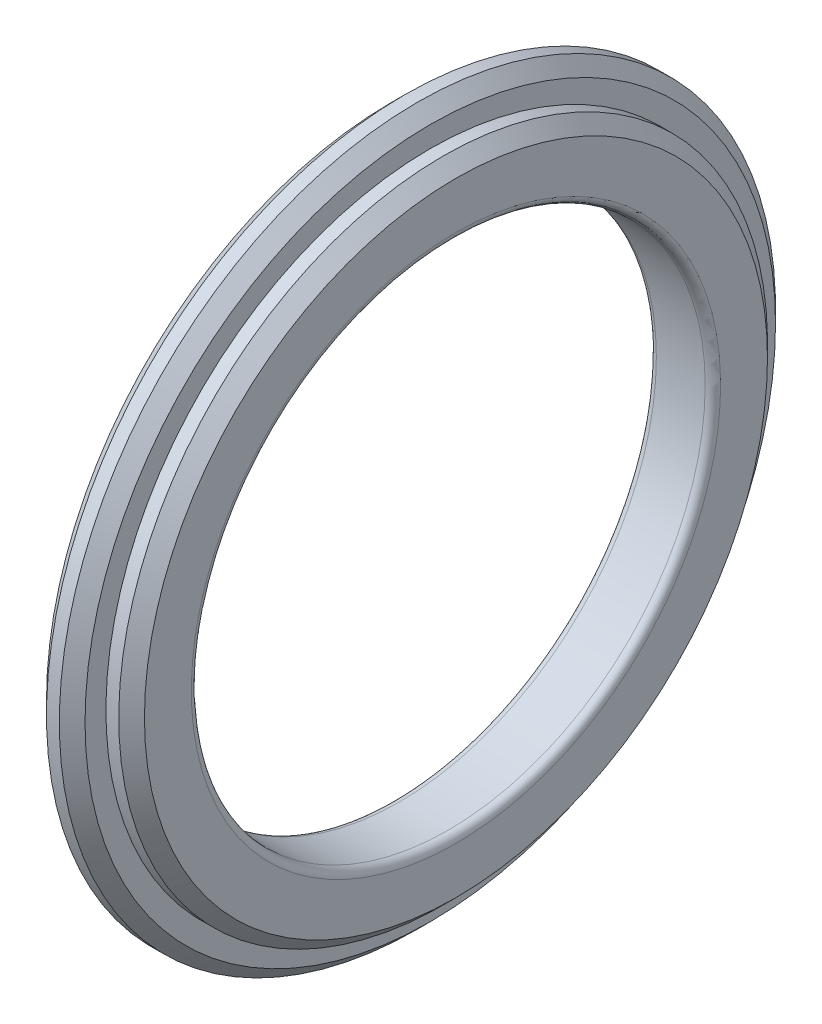
ISO-10303-21;
HEADER;
FILE_DESCRIPTION(('STEP AP214'),'2;1');
FILE_NAME('part.step','',(''),(''),'','','');
FILE_SCHEMA(('AUTOMOTIVE_DESIGN { 1 0 10303 214 1 1 1 1 }'));
ENDSEC;
DATA;
#1=APPLICATION_CONTEXT('core data for automotive mechanical design processes');
#2=APPLICATION_PROTOCOL_DEFINITION('international standard','automotive_design',2000,#1);
#3=PRODUCT_CONTEXT('',#1,'mechanical');
#4=PRODUCT('Part','Part','',(#3));
#5=PRODUCT_RELATED_PRODUCT_CATEGORY('part','',(#4));
#6=PRODUCT_DEFINITION_FORMATION('','',#4);
#7=PRODUCT_DEFINITION_CONTEXT('part definition',#1,'design');
#8=PRODUCT_DEFINITION('design','',#6,#7);
#9=PRODUCT_DEFINITION_SHAPE('','',#8);
#10=(LENGTH_UNIT() NAMED_UNIT(*) SI_UNIT(.MILLI.,.METRE.));
#11=(NAMED_UNIT(*) PLANE_ANGLE_UNIT() SI_UNIT($,.RADIAN.));
#12=(NAMED_UNIT(*) SI_UNIT($,.STERADIAN.) SOLID_ANGLE_UNIT());
#13=UNCERTAINTY_MEASURE_WITH_UNIT(LENGTH_MEASURE(1.E-05),#10,'distance_accuracy_value','');
#14=(GEOMETRIC_REPRESENTATION_CONTEXT(3) GLOBAL_UNCERTAINTY_ASSIGNED_CONTEXT((#13)) GLOBAL_UNIT_ASSIGNED_CONTEXT((#10,
#11,#12)) REPRESENTATION_CONTEXT('',''));
#15=CARTESIAN_POINT('',(0.,0.,0.));
#16=DIRECTION('',(0.,0.,1.));
#17=DIRECTION('',(1.,0.,0.));
#18=AXIS2_PLACEMENT_3D('',#15,#16,#17);
#19=CARTESIAN_POINT('',(30.5,0.,0.));
#20=DIRECTION('',(-1.,0.,0.));
#21=DIRECTION('',(0.,1.,0.));
#22=AXIS2_PLACEMENT_3D('',#19,#20,#21);
#23=CONICAL_SURFACE('',#22,24.75,0.785398163397448);
#24=CARTESIAN_POINT('',(30.,0.,0.));
#25=DIRECTION('',(1.,0.,0.));
#26=DIRECTION('',(0.,1.,0.));
#27=AXIS2_PLACEMENT_3D('',#24,#25,#26);
#28=CIRCLE('',#27,25.25);
#29=CARTESIAN_POINT('',(30.,25.25,0.));
#30=VERTEX_POINT('',#29);
#31=EDGE_CURVE('E11',#30,#30,#28,.T.);
#32=ORIENTED_EDGE('',*,*,#31,.T.);
#33=EDGE_LOOP('',(#32));
#34=FACE_BOUND('',#33,.T.);
#35=CARTESIAN_POINT('',(31.,0.,0.));
#36=DIRECTION('',(1.,0.,0.));
#37=DIRECTION('',(0.,1.,0.));
#38=AXIS2_PLACEMENT_3D('',#35,#36,#37);
#39=CIRCLE('',#38,24.25);
#40=CARTESIAN_POINT('',(31.,24.25,0.));
#41=VERTEX_POINT('',#40);
#42=EDGE_CURVE('E83',#41,#41,#39,.T.);
#43=ORIENTED_EDGE('',*,*,#42,.F.);
#44=EDGE_LOOP('',(#43));
#45=FACE_BOUND('',#44,.T.);
#46=ADVANCED_FACE('F17',(#34,#45),#23,.T.);
#47=CARTESIAN_POINT('',(29.5,0.,0.));
#48=DIRECTION('',(-1.,0.,0.));
#49=DIRECTION('',(0.,1.,0.));
#50=AXIS2_PLACEMENT_3D('',#47,#48,#49);
#51=CYLINDRICAL_SURFACE('',#50,25.25);
#52=CARTESIAN_POINT('',(29.,0.,0.));
#53=DIRECTION('',(1.,0.,0.));
#54=DIRECTION('',(0.,1.,0.));
#55=AXIS2_PLACEMENT_3D('',#52,#53,#54);
#56=CIRCLE('',#55,25.25);
#57=CARTESIAN_POINT('',(29.,25.25,0.));
#58=VERTEX_POINT('',#57);
#59=EDGE_CURVE('E27',#58,#58,#56,.T.);
#60=ORIENTED_EDGE('',*,*,#59,.T.);
#61=EDGE_LOOP('',(#60));
#62=FACE_BOUND('',#61,.T.);
#63=ORIENTED_EDGE('',*,*,#31,.F.);
#64=EDGE_LOOP('',(#63));
#65=FACE_BOUND('',#64,.T.);
#66=ADVANCED_FACE('F112',(#62,#65),#51,.T.);
#67=CARTESIAN_POINT('',(29.,26.0625,0.));
#68=DIRECTION('',(1.,0.,0.));
#69=DIRECTION('',(0.,1.,0.));
#70=AXIS2_PLACEMENT_3D('',#67,#68,#69);
#71=PLANE('',#70);
#72=CARTESIAN_POINT('',(29.,0.,0.));
#73=DIRECTION('',(1.,0.,0.));
#74=DIRECTION('',(0.,1.,0.));
#75=AXIS2_PLACEMENT_3D('',#72,#73,#74);
#76=CIRCLE('',#75,26.875);
#77=CARTESIAN_POINT('',(29.,26.875,0.));
#78=VERTEX_POINT('',#77);
#79=EDGE_CURVE('E70',#78,#78,#76,.T.);
#80=ORIENTED_EDGE('',*,*,#79,.T.);
#81=EDGE_LOOP('',(#80));
#82=FACE_BOUND('',#81,.T.);
#83=ORIENTED_EDGE('',*,*,#59,.F.);
#84=EDGE_LOOP('',(#83));
#85=FACE_BOUND('',#84,.T.);
#86=ADVANCED_FACE('F71',(#82,#85),#71,.T.);
#87=CARTESIAN_POINT('',(28.5,0.,0.));
#88=DIRECTION('',(-1.,0.,0.));
#89=DIRECTION('',(0.,1.,0.));
#90=AXIS2_PLACEMENT_3D('',#87,#88,#89);
#91=CONICAL_SURFACE('',#90,27.375,0.785398163397448);
#92=CARTESIAN_POINT('',(28.,0.,0.));
#93=DIRECTION('',(1.,0.,0.));
#94=DIRECTION('',(0.,1.,0.));
#95=AXIS2_PLACEMENT_3D('',#92,#93,#94);
#96=CIRCLE('',#95,27.875);
#97=CARTESIAN_POINT('',(28.,27.875,0.));
#98=VERTEX_POINT('',#97);
#99=EDGE_CURVE('E66',#98,#98,#96,.T.);
#100=ORIENTED_EDGE('',*,*,#99,.T.);
#101=EDGE_LOOP('',(#100));
#102=FACE_BOUND('',#101,.T.);
#103=ORIENTED_EDGE('',*,*,#79,.F.);
#104=EDGE_LOOP('',(#103));
#105=FACE_BOUND('',#104,.T.);
#106=ADVANCED_FACE('F120',(#102,#105),#91,.T.);
#107=CARTESIAN_POINT('',(27.5,0.,0.));
#108=DIRECTION('',(-1.,0.,0.));
#109=DIRECTION('',(0.,1.,0.));
#110=AXIS2_PLACEMENT_3D('',#107,#108,#109);
#111=CYLINDRICAL_SURFACE('',#110,27.875);
#112=CARTESIAN_POINT('',(27.,0.,0.));
#113=DIRECTION('',(1.,0.,0.));
#114=DIRECTION('',(0.,1.,0.));
#115=AXIS2_PLACEMENT_3D('',#112,#113,#114);
#116=CIRCLE('',#115,27.875);
#117=CARTESIAN_POINT('',(27.,27.875,0.));
#118=VERTEX_POINT('',#117);
#119=EDGE_CURVE('E62',#118,#118,#116,.T.);
#120=ORIENTED_EDGE('',*,*,#119,.T.);
#121=EDGE_LOOP('',(#120));
#122=FACE_BOUND('',#121,.T.);
#123=ORIENTED_EDGE('',*,*,#99,.F.);
#124=EDGE_LOOP('',(#123));
#125=FACE_BOUND('',#124,.T.);
#126=ADVANCED_FACE('F19',(#122,#125),#111,.T.);
#127=CARTESIAN_POINT('',(26.5,0.,0.));
#128=DIRECTION('',(1.,0.,0.));
#129=DIRECTION('',(0.,1.,0.));
#130=AXIS2_PLACEMENT_3D('',#127,#128,#129);
#131=CONICAL_SURFACE('',#130,27.375,0.785398163397448);
#132=CARTESIAN_POINT('',(26.,0.,0.));
#133=DIRECTION('',(1.,0.,0.));
#134=DIRECTION('',(0.,1.,0.));
#135=AXIS2_PLACEMENT_3D('',#132,#133,#134);
#136=CIRCLE('',#135,26.875);
#137=CARTESIAN_POINT('',(26.,26.875,0.));
#138=VERTEX_POINT('',#137);
#139=EDGE_CURVE('E58',#138,#138,#136,.T.);
#140=ORIENTED_EDGE('',*,*,#139,.T.);
#141=EDGE_LOOP('',(#140));
#142=FACE_BOUND('',#141,.T.);
#143=ORIENTED_EDGE('',*,*,#119,.F.);
#144=EDGE_LOOP('',(#143));
#145=FACE_BOUND('',#144,.T.);
#146=ADVANCED_FACE('F108',(#142,#145),#131,.T.);
#147=CARTESIAN_POINT('',(26.,23.7375,0.));
#148=DIRECTION('',(-1.,0.,0.));
#149=DIRECTION('',(0.,-1.,0.));
#150=AXIS2_PLACEMENT_3D('',#147,#148,#149);
#151=PLANE('',#150);
#152=CARTESIAN_POINT('',(26.,0.,0.));
#153=DIRECTION('',(1.,0.,0.));
#154=DIRECTION('',(0.,1.,0.));
#155=AXIS2_PLACEMENT_3D('',#152,#153,#154);
#156=CIRCLE('',#155,20.6);
#157=CARTESIAN_POINT('',(26.,20.6,0.));
#158=VERTEX_POINT('',#157);
#159=EDGE_CURVE('E80',#158,#158,#156,.T.);
#160=ORIENTED_EDGE('',*,*,#159,.T.);
#161=EDGE_LOOP('',(#160));
#162=FACE_BOUND('',#161,.T.);
#163=ORIENTED_EDGE('',*,*,#139,.F.);
#164=EDGE_LOOP('',(#163));
#165=FACE_BOUND('',#164,.T.);
#166=ADVANCED_FACE('F94',(#162,#165),#151,.T.);
#167=CARTESIAN_POINT('',(26.6,0.,0.));
#168=DIRECTION('',(1.,0.,0.));
#169=DIRECTION('',(0.,0.,-1.));
#170=AXIS2_PLACEMENT_3D('',#167,#168,#169);
#171=TOROIDAL_SURFACE('',#170,20.6,0.6);
#172=CARTESIAN_POINT('',(26.6,0.,0.));
#173=DIRECTION('',(1.,0.,0.));
#174=DIRECTION('',(0.,1.,0.));
#175=AXIS2_PLACEMENT_3D('',#172,#173,#174);
#176=CIRCLE('',#175,20.);
#177=CARTESIAN_POINT('',(26.6,20.,0.));
#178=VERTEX_POINT('',#177);
#179=EDGE_CURVE('E79',#178,#178,#176,.T.);
#180=ORIENTED_EDGE('',*,*,#179,.T.);
#181=EDGE_LOOP('',(#180));
#182=FACE_BOUND('',#181,.T.);
#183=ORIENTED_EDGE('',*,*,#159,.F.);
#184=EDGE_LOOP('',(#183));
#185=FACE_BOUND('',#184,.T.);
#186=ADVANCED_FACE('F97',(#182,#185),#171,.T.);
#187=CARTESIAN_POINT('',(28.5,0.,0.));
#188=DIRECTION('',(-1.,0.,0.));
#189=DIRECTION('',(0.,1.,0.));
#190=AXIS2_PLACEMENT_3D('',#187,#188,#189);
#191=CYLINDRICAL_SURFACE('',#190,20.);
#192=CARTESIAN_POINT('',(30.4,0.,0.));
#193=DIRECTION('',(1.,0.,0.));
#194=DIRECTION('',(0.,1.,0.));
#195=AXIS2_PLACEMENT_3D('',#192,#193,#194);
#196=CIRCLE('',#195,20.);
#197=CARTESIAN_POINT('',(30.4,20.,0.));
#198=VERTEX_POINT('',#197);
#199=EDGE_CURVE('E21',#198,#198,#196,.T.);
#200=ORIENTED_EDGE('',*,*,#199,.T.);
#201=EDGE_LOOP('',(#200));
#202=FACE_BOUND('',#201,.T.);
#203=ORIENTED_EDGE('',*,*,#179,.F.);
#204=EDGE_LOOP('',(#203));
#205=FACE_BOUND('',#204,.T.);
#206=ADVANCED_FACE('F99',(#202,#205),#191,.F.);
#207=CARTESIAN_POINT('',(30.4,0.,0.));
#208=DIRECTION('',(1.,0.,0.));
#209=DIRECTION('',(0.,0.,-1.));
#210=AXIS2_PLACEMENT_3D('',#207,#208,#209);
#211=TOROIDAL_SURFACE('',#210,20.6,0.6);
#212=CARTESIAN_POINT('',(31.,0.,0.));
#213=DIRECTION('',(1.,0.,0.));
#214=DIRECTION('',(0.,1.,0.));
#215=AXIS2_PLACEMENT_3D('',#212,#213,#214);
#216=CIRCLE('',#215,20.6);
#217=CARTESIAN_POINT('',(31.,20.6,0.));
#218=VERTEX_POINT('',#217);
#219=EDGE_CURVE('E82',#218,#218,#216,.T.);
#220=ORIENTED_EDGE('',*,*,#219,.T.);
#221=EDGE_LOOP('',(#220));
#222=FACE_BOUND('',#221,.T.);
#223=ORIENTED_EDGE('',*,*,#199,.F.);
#224=EDGE_LOOP('',(#223));
#225=FACE_BOUND('',#224,.T.);
#226=ADVANCED_FACE('F106',(#222,#225),#211,.T.);
#227=CARTESIAN_POINT('',(31.,22.425,0.));
#228=DIRECTION('',(1.,0.,0.));
#229=DIRECTION('',(0.,1.,0.));
#230=AXIS2_PLACEMENT_3D('',#227,#228,#229);
#231=PLANE('',#230);
#232=ORIENTED_EDGE('',*,*,#42,.T.);
#233=EDGE_LOOP('',(#232));
#234=FACE_BOUND('',#233,.T.);
#235=ORIENTED_EDGE('',*,*,#219,.F.);
#236=EDGE_LOOP('',(#235));
#237=FACE_BOUND('',#236,.T.);
#238=ADVANCED_FACE('F124',(#234,#237),#231,.T.);
#239=CLOSED_SHELL('',(#46,#66,#86,#106,#126,#146,#166,#186,#206,#226,#238));
#240=MANIFOLD_SOLID_BREP('B1',#239);
#241=ADVANCED_BREP_SHAPE_REPRESENTATION('',(#18,#240),#14);
#242=SHAPE_DEFINITION_REPRESENTATION(#9,#241);
ENDSEC;
END-ISO-10303-21;
